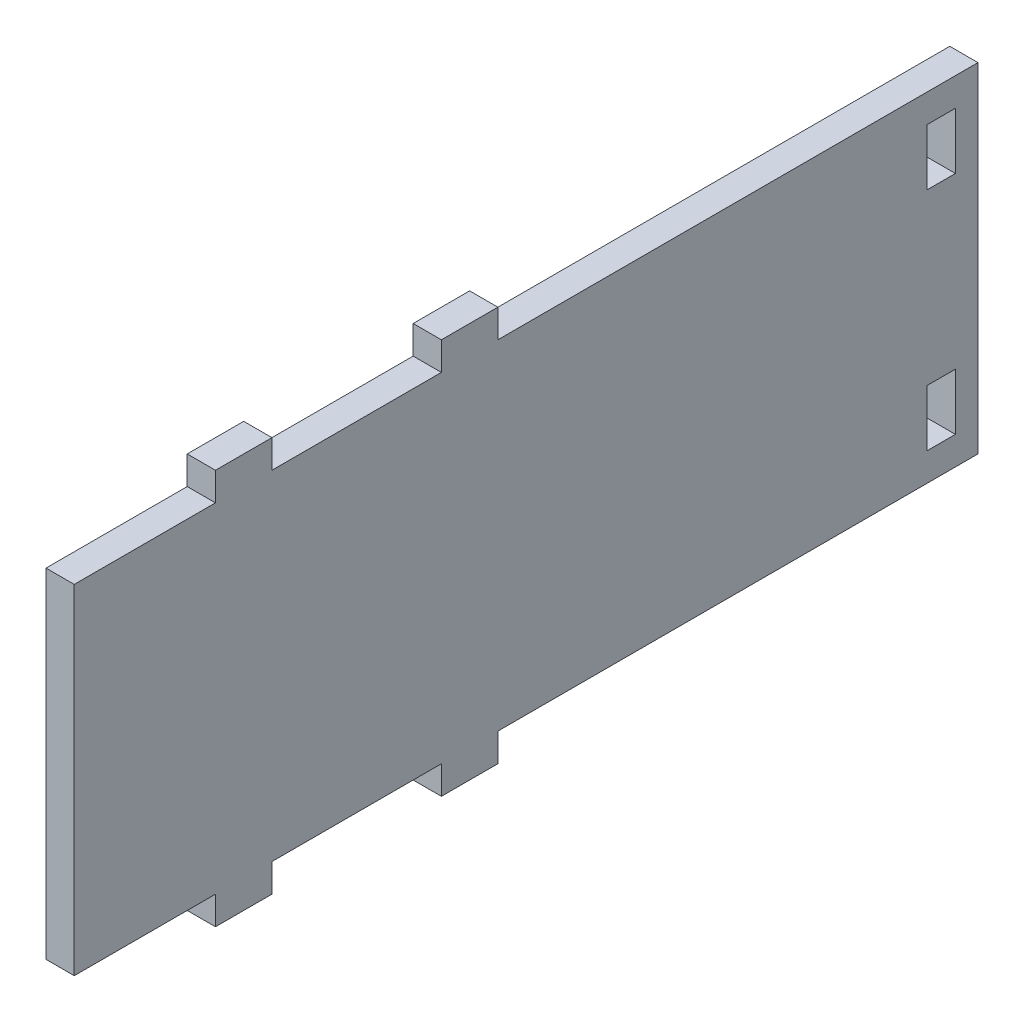
ISO-10303-21;
HEADER;
FILE_DESCRIPTION(('STEP AP214'),'2;1');
FILE_NAME('part.step','',(''),(''),'','','');
FILE_SCHEMA(('AUTOMOTIVE_DESIGN { 1 0 10303 214 1 1 1 1 }'));
ENDSEC;
DATA;
#1=APPLICATION_CONTEXT('core data for automotive mechanical design processes');
#2=APPLICATION_PROTOCOL_DEFINITION('international standard','automotive_design',2000,#1);
#3=PRODUCT_CONTEXT('',#1,'mechanical');
#4=PRODUCT('Part','Part','',(#3));
#5=PRODUCT_RELATED_PRODUCT_CATEGORY('part','',(#4));
#6=PRODUCT_DEFINITION_FORMATION('','',#4);
#7=PRODUCT_DEFINITION_CONTEXT('part definition',#1,'design');
#8=PRODUCT_DEFINITION('design','',#6,#7);
#9=PRODUCT_DEFINITION_SHAPE('','',#8);
#10=(LENGTH_UNIT() NAMED_UNIT(*) SI_UNIT(.MILLI.,.METRE.));
#11=(NAMED_UNIT(*) PLANE_ANGLE_UNIT() SI_UNIT($,.RADIAN.));
#12=(NAMED_UNIT(*) SI_UNIT($,.STERADIAN.) SOLID_ANGLE_UNIT());
#13=UNCERTAINTY_MEASURE_WITH_UNIT(LENGTH_MEASURE(1.E-05),#10,'distance_accuracy_value','');
#14=(GEOMETRIC_REPRESENTATION_CONTEXT(3) GLOBAL_UNCERTAINTY_ASSIGNED_CONTEXT((#13)) GLOBAL_UNIT_ASSIGNED_CONTEXT((#10,
#11,#12)) REPRESENTATION_CONTEXT('',''));
#15=CARTESIAN_POINT('',(0.,0.,0.));
#16=DIRECTION('',(0.,0.,1.));
#17=DIRECTION('',(1.,0.,0.));
#18=AXIS2_PLACEMENT_3D('',#15,#16,#17);
#19=CARTESIAN_POINT('',(2.5,-15.,0.));
#20=DIRECTION('',(0.,1.,0.));
#21=DIRECTION('',(0.,0.,1.));
#22=AXIS2_PLACEMENT_3D('',#19,#20,#21);
#23=PLANE('',#22);
#24=DIRECTION('',(0.,0.,-1.));
#25=VECTOR('',#24,1.);
#26=CARTESIAN_POINT('',(0.,-15.,0.));
#27=LINE('',#26,#25);
#28=CARTESIAN_POINT('',(0.,-15.,72.5));
#29=VERTEX_POINT('',#28);
#30=CARTESIAN_POINT('',(0.,-15.,57.5));
#31=VERTEX_POINT('',#30);
#32=EDGE_CURVE('E301',#29,#31,#27,.T.);
#33=ORIENTED_EDGE('',*,*,#32,.T.);
#34=DIRECTION('',(-1.,0.,0.));
#35=VECTOR('',#34,1.);
#36=CARTESIAN_POINT('',(2.5,-15.,57.5));
#37=LINE('',#36,#35);
#38=CARTESIAN_POINT('',(2.5,-15.,57.5));
#39=VERTEX_POINT('',#38);
#40=EDGE_CURVE('E11',#39,#31,#37,.T.);
#41=ORIENTED_EDGE('',*,*,#40,.F.);
#42=DIRECTION('',(0.,0.,-1.));
#43=VECTOR('',#42,1.);
#44=CARTESIAN_POINT('',(2.5,-15.,0.));
#45=LINE('',#44,#43);
#46=CARTESIAN_POINT('',(2.5,-15.,72.5));
#47=VERTEX_POINT('',#46);
#48=EDGE_CURVE('E519',#47,#39,#45,.T.);
#49=ORIENTED_EDGE('',*,*,#48,.F.);
#50=DIRECTION('',(-1.,0.,0.));
#51=VECTOR('',#50,1.);
#52=CARTESIAN_POINT('',(2.5,-15.,72.5));
#53=LINE('',#52,#51);
#54=EDGE_CURVE('E61',#47,#29,#53,.T.);
#55=ORIENTED_EDGE('',*,*,#54,.T.);
#56=EDGE_LOOP('',(#33,#41,#49,#55));
#57=FACE_BOUND('',#56,.T.);
#58=ADVANCED_FACE('F41',(#57),#23,.F.);
#59=CARTESIAN_POINT('',(2.5,0.,57.5));
#60=DIRECTION('',(0.,0.,-1.));
#61=DIRECTION('',(-1.,0.,0.));
#62=AXIS2_PLACEMENT_3D('',#59,#60,#61);
#63=PLANE('',#62);
#64=DIRECTION('',(0.,-1.,0.));
#65=VECTOR('',#64,1.);
#66=CARTESIAN_POINT('',(0.,0.,57.5));
#67=LINE('',#66,#65);
#68=CARTESIAN_POINT('',(0.,-17.5,57.5));
#69=VERTEX_POINT('',#68);
#70=EDGE_CURVE('E304',#31,#69,#67,.T.);
#71=ORIENTED_EDGE('',*,*,#70,.T.);
#72=DIRECTION('',(-1.,0.,0.));
#73=VECTOR('',#72,1.);
#74=CARTESIAN_POINT('',(2.5,-17.5,57.5));
#75=LINE('',#74,#73);
#76=CARTESIAN_POINT('',(2.5,-17.5,57.5));
#77=VERTEX_POINT('',#76);
#78=EDGE_CURVE('E52',#77,#69,#75,.T.);
#79=ORIENTED_EDGE('',*,*,#78,.F.);
#80=DIRECTION('',(0.,-1.,0.));
#81=VECTOR('',#80,1.);
#82=CARTESIAN_POINT('',(2.5,0.,57.5));
#83=LINE('',#82,#81);
#84=EDGE_CURVE('E594',#39,#77,#83,.T.);
#85=ORIENTED_EDGE('',*,*,#84,.F.);
#86=ORIENTED_EDGE('',*,*,#40,.T.);
#87=EDGE_LOOP('',(#71,#79,#85,#86));
#88=FACE_BOUND('',#87,.T.);
#89=ADVANCED_FACE('F471',(#88),#63,.F.);
#90=CARTESIAN_POINT('',(2.5,-17.5,0.));
#91=DIRECTION('',(0.,1.,0.));
#92=DIRECTION('',(0.,0.,1.));
#93=AXIS2_PLACEMENT_3D('',#90,#91,#92);
#94=PLANE('',#93);
#95=DIRECTION('',(0.,0.,-1.));
#96=VECTOR('',#95,1.);
#97=CARTESIAN_POINT('',(0.,-17.5,0.));
#98=LINE('',#97,#96);
#99=CARTESIAN_POINT('',(0.,-17.5,52.5));
#100=VERTEX_POINT('',#99);
#101=EDGE_CURVE('E308',#69,#100,#98,.T.);
#102=ORIENTED_EDGE('',*,*,#101,.T.);
#103=DIRECTION('',(-1.,0.,0.));
#104=VECTOR('',#103,1.);
#105=CARTESIAN_POINT('',(2.5,-17.5,52.5));
#106=LINE('',#105,#104);
#107=CARTESIAN_POINT('',(2.5,-17.5,52.5));
#108=VERTEX_POINT('',#107);
#109=EDGE_CURVE('E416',#108,#100,#106,.T.);
#110=ORIENTED_EDGE('',*,*,#109,.F.);
#111=DIRECTION('',(0.,0.,-1.));
#112=VECTOR('',#111,1.);
#113=CARTESIAN_POINT('',(2.5,-17.5,0.));
#114=LINE('',#113,#112);
#115=EDGE_CURVE('E596',#77,#108,#114,.T.);
#116=ORIENTED_EDGE('',*,*,#115,.F.);
#117=ORIENTED_EDGE('',*,*,#78,.T.);
#118=EDGE_LOOP('',(#102,#110,#116,#117));
#119=FACE_BOUND('',#118,.T.);
#120=ADVANCED_FACE('F477',(#119),#94,.F.);
#121=CARTESIAN_POINT('',(2.5,0.,52.5));
#122=DIRECTION('',(0.,0.,-1.));
#123=DIRECTION('',(-1.,0.,0.));
#124=AXIS2_PLACEMENT_3D('',#121,#122,#123);
#125=PLANE('',#124);
#126=DIRECTION('',(0.,-1.,0.));
#127=VECTOR('',#126,1.);
#128=CARTESIAN_POINT('',(0.,0.,52.5));
#129=LINE('',#128,#127);
#130=CARTESIAN_POINT('',(0.,-15.,52.5));
#131=VERTEX_POINT('',#130);
#132=EDGE_CURVE('E312',#131,#100,#129,.T.);
#133=ORIENTED_EDGE('',*,*,#132,.F.);
#134=DIRECTION('',(-1.,0.,0.));
#135=VECTOR('',#134,1.);
#136=CARTESIAN_POINT('',(2.5,-15.,52.5));
#137=LINE('',#136,#135);
#138=CARTESIAN_POINT('',(2.5,-15.,52.5));
#139=VERTEX_POINT('',#138);
#140=EDGE_CURVE('E413',#139,#131,#137,.T.);
#141=ORIENTED_EDGE('',*,*,#140,.F.);
#142=DIRECTION('',(0.,-1.,0.));
#143=VECTOR('',#142,1.);
#144=CARTESIAN_POINT('',(2.5,0.,52.5));
#145=LINE('',#144,#143);
#146=EDGE_CURVE('E517',#139,#108,#145,.T.);
#147=ORIENTED_EDGE('',*,*,#146,.T.);
#148=ORIENTED_EDGE('',*,*,#109,.T.);
#149=EDGE_LOOP('',(#133,#141,#147,#148));
#150=FACE_BOUND('',#149,.T.);
#151=ADVANCED_FACE('F484',(#150),#125,.T.);
#152=CARTESIAN_POINT('',(0.,-15.,9.99999999999998));
#153=VERTEX_POINT('',#152);
#154=EDGE_CURVE('E305',#131,#153,#27,.T.);
#155=ORIENTED_EDGE('',*,*,#154,.T.);
#156=DIRECTION('',(-1.,0.,0.));
#157=VECTOR('',#156,1.);
#158=CARTESIAN_POINT('',(2.5,-15.,9.99999999999998));
#159=LINE('',#158,#157);
#160=CARTESIAN_POINT('',(2.5,-15.,9.99999999999998));
#161=VERTEX_POINT('',#160);
#162=EDGE_CURVE('E410',#161,#153,#159,.T.);
#163=ORIENTED_EDGE('',*,*,#162,.F.);
#164=EDGE_CURVE('E510',#139,#161,#45,.T.);
#165=ORIENTED_EDGE('',*,*,#164,.F.);
#166=ORIENTED_EDGE('',*,*,#140,.T.);
#167=EDGE_LOOP('',(#155,#163,#165,#166));
#168=FACE_BOUND('',#167,.T.);
#169=ADVANCED_FACE('F473',(#168),#23,.F.);
#170=CARTESIAN_POINT('',(2.5,0.,9.99999999999998));
#171=DIRECTION('',(0.,0.,-1.));
#172=DIRECTION('',(-1.,0.,0.));
#173=AXIS2_PLACEMENT_3D('',#170,#171,#172);
#174=PLANE('',#173);
#175=DIRECTION('',(0.,-1.,0.));
#176=VECTOR('',#175,1.);
#177=CARTESIAN_POINT('',(0.,0.,9.99999999999998));
#178=LINE('',#177,#176);
#179=CARTESIAN_POINT('',(0.,15.,9.99999999999998));
#180=VERTEX_POINT('',#179);
#181=EDGE_CURVE('E316',#180,#153,#178,.T.);
#182=ORIENTED_EDGE('',*,*,#181,.F.);
#183=DIRECTION('',(-1.,0.,0.));
#184=VECTOR('',#183,1.);
#185=CARTESIAN_POINT('',(2.5,15.,9.99999999999998));
#186=LINE('',#185,#184);
#187=CARTESIAN_POINT('',(2.5,15.,9.99999999999998));
#188=VERTEX_POINT('',#187);
#189=EDGE_CURVE('E407',#188,#180,#186,.T.);
#190=ORIENTED_EDGE('',*,*,#189,.F.);
#191=DIRECTION('',(0.,-1.,0.));
#192=VECTOR('',#191,1.);
#193=CARTESIAN_POINT('',(2.5,0.,9.99999999999998));
#194=LINE('',#193,#192);
#195=EDGE_CURVE('E505',#188,#161,#194,.T.);
#196=ORIENTED_EDGE('',*,*,#195,.T.);
#197=ORIENTED_EDGE('',*,*,#162,.T.);
#198=EDGE_LOOP('',(#182,#190,#196,#197));
#199=FACE_BOUND('',#198,.T.);
#200=ADVANCED_FACE('F483',(#199),#174,.T.);
#201=CARTESIAN_POINT('',(2.5,15.,0.));
#202=DIRECTION('',(0.,1.,0.));
#203=DIRECTION('',(0.,0.,1.));
#204=AXIS2_PLACEMENT_3D('',#201,#202,#203);
#205=PLANE('',#204);
#206=DIRECTION('',(0.,0.,-1.));
#207=VECTOR('',#206,1.);
#208=CARTESIAN_POINT('',(0.,15.,0.));
#209=LINE('',#208,#207);
#210=CARTESIAN_POINT('',(0.,15.,52.5));
#211=VERTEX_POINT('',#210);
#212=EDGE_CURVE('E320',#211,#180,#209,.T.);
#213=ORIENTED_EDGE('',*,*,#212,.F.);
#214=DIRECTION('',(-1.,0.,0.));
#215=VECTOR('',#214,1.);
#216=CARTESIAN_POINT('',(2.5,15.,52.5));
#217=LINE('',#216,#215);
#218=CARTESIAN_POINT('',(2.5,15.,52.5));
#219=VERTEX_POINT('',#218);
#220=EDGE_CURVE('E404',#219,#211,#217,.T.);
#221=ORIENTED_EDGE('',*,*,#220,.F.);
#222=DIRECTION('',(0.,0.,-1.));
#223=VECTOR('',#222,1.);
#224=CARTESIAN_POINT('',(2.5,15.,0.));
#225=LINE('',#224,#223);
#226=EDGE_CURVE('E509',#219,#188,#225,.T.);
#227=ORIENTED_EDGE('',*,*,#226,.T.);
#228=ORIENTED_EDGE('',*,*,#189,.T.);
#229=EDGE_LOOP('',(#213,#221,#227,#228));
#230=FACE_BOUND('',#229,.T.);
#231=ADVANCED_FACE('F490',(#230),#205,.T.);
#232=CARTESIAN_POINT('',(2.5,0.,52.5));
#233=DIRECTION('',(0.,0.,1.));
#234=DIRECTION('',(1.,0.,0.));
#235=AXIS2_PLACEMENT_3D('',#232,#233,#234);
#236=PLANE('',#235);
#237=DIRECTION('',(0.,1.,0.));
#238=VECTOR('',#237,1.);
#239=CARTESIAN_POINT('',(0.,0.,52.5));
#240=LINE('',#239,#238);
#241=CARTESIAN_POINT('',(0.,17.5,52.5));
#242=VERTEX_POINT('',#241);
#243=EDGE_CURVE('E324',#211,#242,#240,.T.);
#244=ORIENTED_EDGE('',*,*,#243,.T.);
#245=DIRECTION('',(-1.,0.,0.));
#246=VECTOR('',#245,1.);
#247=CARTESIAN_POINT('',(2.5,17.5,52.5));
#248=LINE('',#247,#246);
#249=CARTESIAN_POINT('',(2.5,17.5,52.5));
#250=VERTEX_POINT('',#249);
#251=EDGE_CURVE('E401',#250,#242,#248,.T.);
#252=ORIENTED_EDGE('',*,*,#251,.F.);
#253=DIRECTION('',(0.,1.,0.));
#254=VECTOR('',#253,1.);
#255=CARTESIAN_POINT('',(2.5,0.,52.5));
#256=LINE('',#255,#254);
#257=EDGE_CURVE('E514',#219,#250,#256,.T.);
#258=ORIENTED_EDGE('',*,*,#257,.F.);
#259=ORIENTED_EDGE('',*,*,#220,.T.);
#260=EDGE_LOOP('',(#244,#252,#258,#259));
#261=FACE_BOUND('',#260,.T.);
#262=ADVANCED_FACE('F654',(#261),#236,.F.);
#263=CARTESIAN_POINT('',(2.5,17.5,0.));
#264=DIRECTION('',(0.,1.,0.));
#265=DIRECTION('',(0.,0.,1.));
#266=AXIS2_PLACEMENT_3D('',#263,#264,#265);
#267=PLANE('',#266);
#268=DIRECTION('',(0.,0.,-1.));
#269=VECTOR('',#268,1.);
#270=CARTESIAN_POINT('',(0.,17.5,0.));
#271=LINE('',#270,#269);
#272=CARTESIAN_POINT('',(0.,17.5,57.5));
#273=VERTEX_POINT('',#272);
#274=EDGE_CURVE('E329',#273,#242,#271,.T.);
#275=ORIENTED_EDGE('',*,*,#274,.F.);
#276=DIRECTION('',(-1.,0.,0.));
#277=VECTOR('',#276,1.);
#278=CARTESIAN_POINT('',(2.5,17.5,57.5));
#279=LINE('',#278,#277);
#280=CARTESIAN_POINT('',(2.5,17.5,57.5));
#281=VERTEX_POINT('',#280);
#282=EDGE_CURVE('E398',#281,#273,#279,.T.);
#283=ORIENTED_EDGE('',*,*,#282,.F.);
#284=DIRECTION('',(0.,0.,-1.));
#285=VECTOR('',#284,1.);
#286=CARTESIAN_POINT('',(2.5,17.5,0.));
#287=LINE('',#286,#285);
#288=EDGE_CURVE('E525',#281,#250,#287,.T.);
#289=ORIENTED_EDGE('',*,*,#288,.T.);
#290=ORIENTED_EDGE('',*,*,#251,.T.);
#291=EDGE_LOOP('',(#275,#283,#289,#290));
#292=FACE_BOUND('',#291,.T.);
#293=ADVANCED_FACE('F651',(#292),#267,.T.);
#294=CARTESIAN_POINT('',(2.5,0.,57.5));
#295=DIRECTION('',(0.,0.,1.));
#296=DIRECTION('',(1.,0.,0.));
#297=AXIS2_PLACEMENT_3D('',#294,#295,#296);
#298=PLANE('',#297);
#299=DIRECTION('',(0.,1.,0.));
#300=VECTOR('',#299,1.);
#301=CARTESIAN_POINT('',(0.,0.,57.5));
#302=LINE('',#301,#300);
#303=CARTESIAN_POINT('',(0.,15.,57.5));
#304=VERTEX_POINT('',#303);
#305=EDGE_CURVE('E333',#304,#273,#302,.T.);
#306=ORIENTED_EDGE('',*,*,#305,.F.);
#307=DIRECTION('',(-1.,0.,0.));
#308=VECTOR('',#307,1.);
#309=CARTESIAN_POINT('',(2.5,15.,57.5));
#310=LINE('',#309,#308);
#311=CARTESIAN_POINT('',(2.5,15.,57.5));
#312=VERTEX_POINT('',#311);
#313=EDGE_CURVE('E395',#312,#304,#310,.T.);
#314=ORIENTED_EDGE('',*,*,#313,.F.);
#315=DIRECTION('',(0.,1.,0.));
#316=VECTOR('',#315,1.);
#317=CARTESIAN_POINT('',(2.5,0.,57.5));
#318=LINE('',#317,#316);
#319=EDGE_CURVE('E529',#312,#281,#318,.T.);
#320=ORIENTED_EDGE('',*,*,#319,.T.);
#321=ORIENTED_EDGE('',*,*,#282,.T.);
#322=EDGE_LOOP('',(#306,#314,#320,#321));
#323=FACE_BOUND('',#322,.T.);
#324=ADVANCED_FACE('F563',(#323),#298,.T.);
#325=CARTESIAN_POINT('',(0.,15.,72.5));
#326=VERTEX_POINT('',#325);
#327=EDGE_CURVE('E325',#326,#304,#209,.T.);
#328=ORIENTED_EDGE('',*,*,#327,.F.);
#329=DIRECTION('',(-1.,0.,0.));
#330=VECTOR('',#329,1.);
#331=CARTESIAN_POINT('',(2.5,15.,72.5));
#332=LINE('',#331,#330);
#333=CARTESIAN_POINT('',(2.5,15.,72.5));
#334=VERTEX_POINT('',#333);
#335=EDGE_CURVE('E392',#334,#326,#332,.T.);
#336=ORIENTED_EDGE('',*,*,#335,.F.);
#337=EDGE_CURVE('E516',#334,#312,#225,.T.);
#338=ORIENTED_EDGE('',*,*,#337,.T.);
#339=ORIENTED_EDGE('',*,*,#313,.T.);
#340=EDGE_LOOP('',(#328,#336,#338,#339));
#341=FACE_BOUND('',#340,.T.);
#342=ADVANCED_FACE('F555',(#341),#205,.T.);
#343=CARTESIAN_POINT('',(2.5,0.,72.5));
#344=DIRECTION('',(0.,0.,1.));
#345=DIRECTION('',(1.,0.,0.));
#346=AXIS2_PLACEMENT_3D('',#343,#344,#345);
#347=PLANE('',#346);
#348=DIRECTION('',(0.,1.,0.));
#349=VECTOR('',#348,1.);
#350=CARTESIAN_POINT('',(0.,0.,72.5));
#351=LINE('',#350,#349);
#352=CARTESIAN_POINT('',(0.,17.4999999999999,72.5));
#353=VERTEX_POINT('',#352);
#354=EDGE_CURVE('E337',#326,#353,#351,.T.);
#355=ORIENTED_EDGE('',*,*,#354,.T.);
#356=DIRECTION('',(-1.,0.,0.));
#357=VECTOR('',#356,1.);
#358=CARTESIAN_POINT('',(2.5,17.4999999999999,72.5));
#359=LINE('',#358,#357);
#360=CARTESIAN_POINT('',(2.5,17.4999999999999,72.5));
#361=VERTEX_POINT('',#360);
#362=EDGE_CURVE('E389',#361,#353,#359,.T.);
#363=ORIENTED_EDGE('',*,*,#362,.F.);
#364=DIRECTION('',(0.,1.,0.));
#365=VECTOR('',#364,1.);
#366=CARTESIAN_POINT('',(2.5,0.,72.5));
#367=LINE('',#366,#365);
#368=EDGE_CURVE('E533',#334,#361,#367,.T.);
#369=ORIENTED_EDGE('',*,*,#368,.F.);
#370=ORIENTED_EDGE('',*,*,#335,.T.);
#371=EDGE_LOOP('',(#355,#363,#369,#370));
#372=FACE_BOUND('',#371,.T.);
#373=ADVANCED_FACE('F642',(#372),#347,.F.);
#374=CARTESIAN_POINT('',(2.5,17.4999999999999,0.));
#375=DIRECTION('',(0.,1.,0.));
#376=DIRECTION('',(0.,0.,1.));
#377=AXIS2_PLACEMENT_3D('',#374,#375,#376);
#378=PLANE('',#377);
#379=DIRECTION('',(0.,0.,-1.));
#380=VECTOR('',#379,1.);
#381=CARTESIAN_POINT('',(0.,17.4999999999999,0.));
#382=LINE('',#381,#380);
#383=CARTESIAN_POINT('',(0.,17.4999999999999,77.5));
#384=VERTEX_POINT('',#383);
#385=EDGE_CURVE('E341',#384,#353,#382,.T.);
#386=ORIENTED_EDGE('',*,*,#385,.F.);
#387=DIRECTION('',(-1.,0.,0.));
#388=VECTOR('',#387,1.);
#389=CARTESIAN_POINT('',(2.5,17.4999999999999,77.5));
#390=LINE('',#389,#388);
#391=CARTESIAN_POINT('',(2.5,17.4999999999999,77.5));
#392=VERTEX_POINT('',#391);
#393=EDGE_CURVE('E386',#392,#384,#390,.T.);
#394=ORIENTED_EDGE('',*,*,#393,.F.);
#395=DIRECTION('',(0.,0.,-1.));
#396=VECTOR('',#395,1.);
#397=CARTESIAN_POINT('',(2.5,17.4999999999999,0.));
#398=LINE('',#397,#396);
#399=EDGE_CURVE('E536',#392,#361,#398,.T.);
#400=ORIENTED_EDGE('',*,*,#399,.T.);
#401=ORIENTED_EDGE('',*,*,#362,.T.);
#402=EDGE_LOOP('',(#386,#394,#400,#401));
#403=FACE_BOUND('',#402,.T.);
#404=ADVANCED_FACE('F638',(#403),#378,.T.);
#405=CARTESIAN_POINT('',(2.5,0.,77.5));
#406=DIRECTION('',(0.,0.,1.));
#407=DIRECTION('',(1.,0.,0.));
#408=AXIS2_PLACEMENT_3D('',#405,#406,#407);
#409=PLANE('',#408);
#410=DIRECTION('',(0.,1.,0.));
#411=VECTOR('',#410,1.);
#412=CARTESIAN_POINT('',(0.,0.,77.5));
#413=LINE('',#412,#411);
#414=CARTESIAN_POINT('',(0.,15.,77.5));
#415=VERTEX_POINT('',#414);
#416=EDGE_CURVE('E345',#415,#384,#413,.T.);
#417=ORIENTED_EDGE('',*,*,#416,.F.);
#418=DIRECTION('',(-1.,0.,0.));
#419=VECTOR('',#418,1.);
#420=CARTESIAN_POINT('',(2.5,15.,77.5));
#421=LINE('',#420,#419);
#422=CARTESIAN_POINT('',(2.5,15.,77.5));
#423=VERTEX_POINT('',#422);
#424=EDGE_CURVE('E383',#423,#415,#421,.T.);
#425=ORIENTED_EDGE('',*,*,#424,.F.);
#426=DIRECTION('',(0.,1.,0.));
#427=VECTOR('',#426,1.);
#428=CARTESIAN_POINT('',(2.5,0.,77.5));
#429=LINE('',#428,#427);
#430=EDGE_CURVE('E540',#423,#392,#429,.T.);
#431=ORIENTED_EDGE('',*,*,#430,.T.);
#432=ORIENTED_EDGE('',*,*,#393,.T.);
#433=EDGE_LOOP('',(#417,#425,#431,#432));
#434=FACE_BOUND('',#433,.T.);
#435=ADVANCED_FACE('F634',(#434),#409,.T.);
#436=CARTESIAN_POINT('',(2.5,15.,0.));
#437=DIRECTION('',(0.,-1.,0.));
#438=DIRECTION('',(0.,0.,-1.));
#439=AXIS2_PLACEMENT_3D('',#436,#437,#438);
#440=PLANE('',#439);
#441=DIRECTION('',(0.,0.,1.));
#442=VECTOR('',#441,1.);
#443=CARTESIAN_POINT('',(0.,15.,0.));
#444=LINE('',#443,#442);
#445=CARTESIAN_POINT('',(0.,15.,90.));
#446=VERTEX_POINT('',#445);
#447=EDGE_CURVE('E349',#415,#446,#444,.T.);
#448=ORIENTED_EDGE('',*,*,#447,.T.);
#449=DIRECTION('',(-1.,0.,0.));
#450=VECTOR('',#449,1.);
#451=CARTESIAN_POINT('',(2.5,15.,90.));
#452=LINE('',#451,#450);
#453=CARTESIAN_POINT('',(2.5,15.,90.));
#454=VERTEX_POINT('',#453);
#455=EDGE_CURVE('E379',#454,#446,#452,.T.);
#456=ORIENTED_EDGE('',*,*,#455,.F.);
#457=DIRECTION('',(0.,0.,1.));
#458=VECTOR('',#457,1.);
#459=CARTESIAN_POINT('',(2.5,15.,0.));
#460=LINE('',#459,#458);
#461=EDGE_CURVE('E544',#423,#454,#460,.T.);
#462=ORIENTED_EDGE('',*,*,#461,.F.);
#463=ORIENTED_EDGE('',*,*,#424,.T.);
#464=EDGE_LOOP('',(#448,#456,#462,#463));
#465=FACE_BOUND('',#464,.T.);
#466=ADVANCED_FACE('F630',(#465),#440,.F.);
#467=CARTESIAN_POINT('',(2.5,0.,90.));
#468=DIRECTION('',(0.,0.,-1.));
#469=DIRECTION('',(-1.,0.,0.));
#470=AXIS2_PLACEMENT_3D('',#467,#468,#469);
#471=PLANE('',#470);
#472=DIRECTION('',(0.,-1.,0.));
#473=VECTOR('',#472,1.);
#474=CARTESIAN_POINT('',(0.,0.,90.));
#475=LINE('',#474,#473);
#476=CARTESIAN_POINT('',(0.,-15.,90.));
#477=VERTEX_POINT('',#476);
#478=EDGE_CURVE('E352',#446,#477,#475,.T.);
#479=ORIENTED_EDGE('',*,*,#478,.T.);
#480=DIRECTION('',(-1.,0.,0.));
#481=VECTOR('',#480,1.);
#482=CARTESIAN_POINT('',(2.5,-15.,90.));
#483=LINE('',#482,#481);
#484=CARTESIAN_POINT('',(2.5,-15.,90.));
#485=VERTEX_POINT('',#484);
#486=EDGE_CURVE('E375',#485,#477,#483,.T.);
#487=ORIENTED_EDGE('',*,*,#486,.F.);
#488=DIRECTION('',(0.,-1.,0.));
#489=VECTOR('',#488,1.);
#490=CARTESIAN_POINT('',(2.5,0.,90.));
#491=LINE('',#490,#489);
#492=EDGE_CURVE('E547',#454,#485,#491,.T.);
#493=ORIENTED_EDGE('',*,*,#492,.F.);
#494=ORIENTED_EDGE('',*,*,#455,.T.);
#495=EDGE_LOOP('',(#479,#487,#493,#494));
#496=FACE_BOUND('',#495,.T.);
#497=ADVANCED_FACE('F626',(#496),#471,.F.);
#498=CARTESIAN_POINT('',(2.5,-15.,0.));
#499=DIRECTION('',(0.,1.,0.));
#500=DIRECTION('',(0.,0.,1.));
#501=AXIS2_PLACEMENT_3D('',#498,#499,#500);
#502=PLANE('',#501);
#503=DIRECTION('',(0.,0.,-1.));
#504=VECTOR('',#503,1.);
#505=CARTESIAN_POINT('',(0.,-15.,0.));
#506=LINE('',#505,#504);
#507=CARTESIAN_POINT('',(0.,-15.,77.5));
#508=VERTEX_POINT('',#507);
#509=EDGE_CURVE('E355',#477,#508,#506,.T.);
#510=ORIENTED_EDGE('',*,*,#509,.T.);
#511=DIRECTION('',(-1.,0.,0.));
#512=VECTOR('',#511,1.);
#513=CARTESIAN_POINT('',(2.5,-15.,77.5));
#514=LINE('',#513,#512);
#515=CARTESIAN_POINT('',(2.5,-15.,77.5));
#516=VERTEX_POINT('',#515);
#517=EDGE_CURVE('E258',#516,#508,#514,.T.);
#518=ORIENTED_EDGE('',*,*,#517,.F.);
#519=DIRECTION('',(0.,0.,-1.));
#520=VECTOR('',#519,1.);
#521=CARTESIAN_POINT('',(2.5,-15.,0.));
#522=LINE('',#521,#520);
#523=EDGE_CURVE('E244',#485,#516,#522,.T.);
#524=ORIENTED_EDGE('',*,*,#523,.F.);
#525=ORIENTED_EDGE('',*,*,#486,.T.);
#526=EDGE_LOOP('',(#510,#518,#524,#525));
#527=FACE_BOUND('',#526,.T.);
#528=ADVANCED_FACE('F623',(#527),#502,.F.);
#529=CARTESIAN_POINT('',(2.5,0.,77.5));
#530=DIRECTION('',(0.,0.,-1.));
#531=DIRECTION('',(-1.,0.,0.));
#532=AXIS2_PLACEMENT_3D('',#529,#530,#531);
#533=PLANE('',#532);
#534=DIRECTION('',(0.,-1.,0.));
#535=VECTOR('',#534,1.);
#536=CARTESIAN_POINT('',(0.,0.,77.5));
#537=LINE('',#536,#535);
#538=CARTESIAN_POINT('',(0.,-17.5000000000001,77.5));
#539=VERTEX_POINT('',#538);
#540=EDGE_CURVE('E254',#508,#539,#537,.T.);
#541=ORIENTED_EDGE('',*,*,#540,.T.);
#542=DIRECTION('',(-1.,0.,0.));
#543=VECTOR('',#542,1.);
#544=CARTESIAN_POINT('',(2.5,-17.5000000000001,77.5));
#545=LINE('',#544,#543);
#546=CARTESIAN_POINT('',(2.5,-17.5000000000001,77.5));
#547=VERTEX_POINT('',#546);
#548=EDGE_CURVE('E251',#547,#539,#545,.T.);
#549=ORIENTED_EDGE('',*,*,#548,.F.);
#550=DIRECTION('',(0.,-1.,0.));
#551=VECTOR('',#550,1.);
#552=CARTESIAN_POINT('',(2.5,0.,77.5));
#553=LINE('',#552,#551);
#554=EDGE_CURVE('E236',#516,#547,#553,.T.);
#555=ORIENTED_EDGE('',*,*,#554,.F.);
#556=ORIENTED_EDGE('',*,*,#517,.T.);
#557=EDGE_LOOP('',(#541,#549,#555,#556));
#558=FACE_BOUND('',#557,.T.);
#559=ADVANCED_FACE('F252',(#558),#533,.F.);
#560=CARTESIAN_POINT('',(2.5,-17.5000000000001,0.));
#561=DIRECTION('',(0.,1.,0.));
#562=DIRECTION('',(0.,0.,1.));
#563=AXIS2_PLACEMENT_3D('',#560,#561,#562);
#564=PLANE('',#563);
#565=DIRECTION('',(0.,0.,-1.));
#566=VECTOR('',#565,1.);
#567=CARTESIAN_POINT('',(0.,-17.5000000000001,0.));
#568=LINE('',#567,#566);
#569=CARTESIAN_POINT('',(0.,-17.5000000000001,72.5));
#570=VERTEX_POINT('',#569);
#571=EDGE_CURVE('E360',#539,#570,#568,.T.);
#572=ORIENTED_EDGE('',*,*,#571,.T.);
#573=DIRECTION('',(-1.,0.,0.));
#574=VECTOR('',#573,1.);
#575=CARTESIAN_POINT('',(2.5,-17.5000000000001,72.5));
#576=LINE('',#575,#574);
#577=CARTESIAN_POINT('',(2.5,-17.5000000000001,72.5));
#578=VERTEX_POINT('',#577);
#579=EDGE_CURVE('E148',#578,#570,#576,.T.);
#580=ORIENTED_EDGE('',*,*,#579,.F.);
#581=DIRECTION('',(0.,0.,-1.));
#582=VECTOR('',#581,1.);
#583=CARTESIAN_POINT('',(2.5,-17.5000000000001,0.));
#584=LINE('',#583,#582);
#585=EDGE_CURVE('E242',#547,#578,#584,.T.);
#586=ORIENTED_EDGE('',*,*,#585,.F.);
#587=ORIENTED_EDGE('',*,*,#548,.T.);
#588=EDGE_LOOP('',(#572,#580,#586,#587));
#589=FACE_BOUND('',#588,.T.);
#590=ADVANCED_FACE('F260',(#589),#564,.F.);
#591=CARTESIAN_POINT('',(2.5,0.,14.5));
#592=DIRECTION('',(0.,0.,-1.));
#593=DIRECTION('',(0.,1.,0.));
#594=AXIS2_PLACEMENT_3D('',#591,#592,#593);
#595=PLANE('',#594);
#596=DIRECTION('',(0.,-1.,0.));
#597=VECTOR('',#596,1.);
#598=CARTESIAN_POINT('',(0.,0.,14.5));
#599=LINE('',#598,#597);
#600=CARTESIAN_POINT('',(0.,12.5,14.5));
#601=VERTEX_POINT('',#600);
#602=CARTESIAN_POINT('',(0.,7.50000000000001,14.5));
#603=VERTEX_POINT('',#602);
#604=EDGE_CURVE('E285',#601,#603,#599,.T.);
#605=ORIENTED_EDGE('',*,*,#604,.F.);
#606=DIRECTION('',(-1.,0.,0.));
#607=VECTOR('',#606,1.);
#608=CARTESIAN_POINT('',(2.5,12.5,14.5));
#609=LINE('',#608,#607);
#610=CARTESIAN_POINT('',(2.5,12.5,14.5));
#611=VERTEX_POINT('',#610);
#612=EDGE_CURVE('E370',#611,#601,#609,.T.);
#613=ORIENTED_EDGE('',*,*,#612,.F.);
#614=DIRECTION('',(0.,-1.,0.));
#615=VECTOR('',#614,1.);
#616=CARTESIAN_POINT('',(2.5,0.,14.5));
#617=LINE('',#616,#615);
#618=CARTESIAN_POINT('',(2.5,7.50000000000001,14.5));
#619=VERTEX_POINT('',#618);
#620=EDGE_CURVE('E577',#611,#619,#617,.T.);
#621=ORIENTED_EDGE('',*,*,#620,.T.);
#622=DIRECTION('',(-1.,0.,0.));
#623=VECTOR('',#622,1.);
#624=CARTESIAN_POINT('',(2.5,7.50000000000001,14.5));
#625=LINE('',#624,#623);
#626=EDGE_CURVE('E422',#619,#603,#625,.T.);
#627=ORIENTED_EDGE('',*,*,#626,.T.);
#628=EDGE_LOOP('',(#605,#613,#621,#627));
#629=FACE_BOUND('',#628,.T.);
#630=ADVANCED_FACE('F620',(#629),#595,.T.);
#631=CARTESIAN_POINT('',(2.5,12.5,0.));
#632=DIRECTION('',(0.,-1.,0.));
#633=DIRECTION('',(0.,0.,-1.));
#634=AXIS2_PLACEMENT_3D('',#631,#632,#633);
#635=PLANE('',#634);
#636=DIRECTION('',(0.,0.,1.));
#637=VECTOR('',#636,1.);
#638=CARTESIAN_POINT('',(0.,12.5,0.));
#639=LINE('',#638,#637);
#640=CARTESIAN_POINT('',(0.,12.5,12.));
#641=VERTEX_POINT('',#640);
#642=EDGE_CURVE('E289',#641,#601,#639,.T.);
#643=ORIENTED_EDGE('',*,*,#642,.F.);
#644=DIRECTION('',(-1.,0.,0.));
#645=VECTOR('',#644,1.);
#646=CARTESIAN_POINT('',(2.5,12.5,12.));
#647=LINE('',#646,#645);
#648=CARTESIAN_POINT('',(2.5,12.5,12.));
#649=VERTEX_POINT('',#648);
#650=EDGE_CURVE('E429',#649,#641,#647,.T.);
#651=ORIENTED_EDGE('',*,*,#650,.F.);
#652=DIRECTION('',(0.,0.,1.));
#653=VECTOR('',#652,1.);
#654=CARTESIAN_POINT('',(2.5,12.5,0.));
#655=LINE('',#654,#653);
#656=EDGE_CURVE('E581',#649,#611,#655,.T.);
#657=ORIENTED_EDGE('',*,*,#656,.T.);
#658=ORIENTED_EDGE('',*,*,#612,.T.);
#659=EDGE_LOOP('',(#643,#651,#657,#658));
#660=FACE_BOUND('',#659,.T.);
#661=ADVANCED_FACE('F748',(#660),#635,.T.);
#662=CARTESIAN_POINT('',(2.5,0.,12.));
#663=DIRECTION('',(0.,0.,-1.));
#664=DIRECTION('',(-1.,0.,0.));
#665=AXIS2_PLACEMENT_3D('',#662,#663,#664);
#666=PLANE('',#665);
#667=DIRECTION('',(0.,-1.,0.));
#668=VECTOR('',#667,1.);
#669=CARTESIAN_POINT('',(0.,0.,12.));
#670=LINE('',#669,#668);
#671=CARTESIAN_POINT('',(0.,7.50000000000001,12.));
#672=VERTEX_POINT('',#671);
#673=EDGE_CURVE('E293',#641,#672,#670,.T.);
#674=ORIENTED_EDGE('',*,*,#673,.T.);
#675=DIRECTION('',(-1.,0.,0.));
#676=VECTOR('',#675,1.);
#677=CARTESIAN_POINT('',(2.5,7.50000000000001,12.));
#678=LINE('',#677,#676);
#679=CARTESIAN_POINT('',(2.5,7.50000000000001,12.));
#680=VERTEX_POINT('',#679);
#681=EDGE_CURVE('E425',#680,#672,#678,.T.);
#682=ORIENTED_EDGE('',*,*,#681,.F.);
#683=DIRECTION('',(0.,-1.,0.));
#684=VECTOR('',#683,1.);
#685=CARTESIAN_POINT('',(2.5,0.,12.));
#686=LINE('',#685,#684);
#687=EDGE_CURVE('E585',#649,#680,#686,.T.);
#688=ORIENTED_EDGE('',*,*,#687,.F.);
#689=ORIENTED_EDGE('',*,*,#650,.T.);
#690=EDGE_LOOP('',(#674,#682,#688,#689));
#691=FACE_BOUND('',#690,.T.);
#692=ADVANCED_FACE('F745',(#691),#666,.F.);
#693=CARTESIAN_POINT('',(2.5,0.,11.9999999999998));
#694=DIRECTION('',(0.,0.,-1.));
#695=DIRECTION('',(-1.,0.,0.));
#696=AXIS2_PLACEMENT_3D('',#693,#694,#695);
#697=PLANE('',#696);
#698=DIRECTION('',(0.,-1.,0.));
#699=VECTOR('',#698,1.);
#700=CARTESIAN_POINT('',(0.,0.,11.9999999999998));
#701=LINE('',#700,#699);
#702=CARTESIAN_POINT('',(0.,-7.5,11.9999999999998));
#703=VERTEX_POINT('',#702);
#704=CARTESIAN_POINT('',(0.,-12.5,11.9999999999998));
#705=VERTEX_POINT('',#704);
#706=EDGE_CURVE('E269',#703,#705,#701,.T.);
#707=ORIENTED_EDGE('',*,*,#706,.T.);
#708=DIRECTION('',(-1.,0.,0.));
#709=VECTOR('',#708,1.);
#710=CARTESIAN_POINT('',(2.5,-12.5,11.9999999999998));
#711=LINE('',#710,#709);
#712=CARTESIAN_POINT('',(2.5,-12.5,11.9999999999998));
#713=VERTEX_POINT('',#712);
#714=EDGE_CURVE('E45',#713,#705,#711,.T.);
#715=ORIENTED_EDGE('',*,*,#714,.F.);
#716=DIRECTION('',(0.,-1.,0.));
#717=VECTOR('',#716,1.);
#718=CARTESIAN_POINT('',(2.5,0.,11.9999999999998));
#719=LINE('',#718,#717);
#720=CARTESIAN_POINT('',(2.5,-7.5,11.9999999999998));
#721=VERTEX_POINT('',#720);
#722=EDGE_CURVE('E367',#721,#713,#719,.T.);
#723=ORIENTED_EDGE('',*,*,#722,.F.);
#724=DIRECTION('',(-1.,0.,0.));
#725=VECTOR('',#724,1.);
#726=CARTESIAN_POINT('',(2.5,-7.5,11.9999999999998));
#727=LINE('',#726,#725);
#728=EDGE_CURVE('E265',#721,#703,#727,.T.);
#729=ORIENTED_EDGE('',*,*,#728,.T.);
#730=EDGE_LOOP('',(#707,#715,#723,#729));
#731=FACE_BOUND('',#730,.T.);
#732=ADVANCED_FACE('F43',(#731),#697,.F.);
#733=CARTESIAN_POINT('',(2.5,-12.5,0.));
#734=DIRECTION('',(0.,-1.,0.));
#735=DIRECTION('',(0.,0.,-1.));
#736=AXIS2_PLACEMENT_3D('',#733,#734,#735);
#737=PLANE('',#736);
#738=DIRECTION('',(0.,0.,1.));
#739=VECTOR('',#738,1.);
#740=CARTESIAN_POINT('',(0.,-12.5,0.));
#741=LINE('',#740,#739);
#742=CARTESIAN_POINT('',(0.,-12.5,14.4999999999998));
#743=VERTEX_POINT('',#742);
#744=EDGE_CURVE('E273',#705,#743,#741,.T.);
#745=ORIENTED_EDGE('',*,*,#744,.T.);
#746=DIRECTION('',(-1.,0.,0.));
#747=VECTOR('',#746,1.);
#748=CARTESIAN_POINT('',(2.5,-12.5,14.4999999999998));
#749=LINE('',#748,#747);
#750=CARTESIAN_POINT('',(2.5,-12.5,14.4999999999998));
#751=VERTEX_POINT('',#750);
#752=EDGE_CURVE('E438',#751,#743,#749,.T.);
#753=ORIENTED_EDGE('',*,*,#752,.F.);
#754=DIRECTION('',(0.,0.,1.));
#755=VECTOR('',#754,1.);
#756=CARTESIAN_POINT('',(2.5,-12.5,0.));
#757=LINE('',#756,#755);
#758=EDGE_CURVE('E161',#713,#751,#757,.T.);
#759=ORIENTED_EDGE('',*,*,#758,.F.);
#760=ORIENTED_EDGE('',*,*,#714,.T.);
#761=EDGE_LOOP('',(#745,#753,#759,#760));
#762=FACE_BOUND('',#761,.T.);
#763=ADVANCED_FACE('F445',(#762),#737,.F.);
#764=CARTESIAN_POINT('',(2.5,0.,14.4999999999998));
#765=DIRECTION('',(0.,0.,-1.));
#766=DIRECTION('',(0.,1.,0.));
#767=AXIS2_PLACEMENT_3D('',#764,#765,#766);
#768=PLANE('',#767);
#769=DIRECTION('',(0.,-1.,0.));
#770=VECTOR('',#769,1.);
#771=CARTESIAN_POINT('',(0.,0.,14.4999999999998));
#772=LINE('',#771,#770);
#773=CARTESIAN_POINT('',(0.,-7.5,14.4999999999998));
#774=VERTEX_POINT('',#773);
#775=EDGE_CURVE('E277',#774,#743,#772,.T.);
#776=ORIENTED_EDGE('',*,*,#775,.F.);
#777=DIRECTION('',(-1.,0.,0.));
#778=VECTOR('',#777,1.);
#779=CARTESIAN_POINT('',(2.5,-7.5,14.4999999999998));
#780=LINE('',#779,#778);
#781=CARTESIAN_POINT('',(2.5,-7.5,14.4999999999998));
#782=VERTEX_POINT('',#781);
#783=EDGE_CURVE('E436',#782,#774,#780,.T.);
#784=ORIENTED_EDGE('',*,*,#783,.F.);
#785=DIRECTION('',(0.,-1.,0.));
#786=VECTOR('',#785,1.);
#787=CARTESIAN_POINT('',(2.5,0.,14.4999999999998));
#788=LINE('',#787,#786);
#789=EDGE_CURVE('E572',#782,#751,#788,.T.);
#790=ORIENTED_EDGE('',*,*,#789,.T.);
#791=ORIENTED_EDGE('',*,*,#752,.T.);
#792=EDGE_LOOP('',(#776,#784,#790,#791));
#793=FACE_BOUND('',#792,.T.);
#794=ADVANCED_FACE('F459',(#793),#768,.T.);
#795=CARTESIAN_POINT('',(2.5,7.50000000000001,0.));
#796=DIRECTION('',(0.,-1.,0.));
#797=DIRECTION('',(0.,0.,-1.));
#798=AXIS2_PLACEMENT_3D('',#795,#796,#797);
#799=PLANE('',#798);
#800=DIRECTION('',(0.,0.,1.));
#801=VECTOR('',#800,1.);
#802=CARTESIAN_POINT('',(0.,7.50000000000001,0.));
#803=LINE('',#802,#801);
#804=EDGE_CURVE('E297',#672,#603,#803,.T.);
#805=ORIENTED_EDGE('',*,*,#804,.T.);
#806=ORIENTED_EDGE('',*,*,#626,.F.);
#807=DIRECTION('',(0.,0.,1.));
#808=VECTOR('',#807,1.);
#809=CARTESIAN_POINT('',(2.5,7.50000000000001,0.));
#810=LINE('',#809,#808);
#811=EDGE_CURVE('E589',#680,#619,#810,.T.);
#812=ORIENTED_EDGE('',*,*,#811,.F.);
#813=ORIENTED_EDGE('',*,*,#681,.T.);
#814=EDGE_LOOP('',(#805,#806,#812,#813));
#815=FACE_BOUND('',#814,.T.);
#816=ADVANCED_FACE('F461',(#815),#799,.F.);
#817=CARTESIAN_POINT('',(2.5,-7.5,0.));
#818=DIRECTION('',(0.,-1.,0.));
#819=DIRECTION('',(0.,0.,-1.));
#820=AXIS2_PLACEMENT_3D('',#817,#818,#819);
#821=PLANE('',#820);
#822=DIRECTION('',(0.,0.,1.));
#823=VECTOR('',#822,1.);
#824=CARTESIAN_POINT('',(0.,-7.5,0.));
#825=LINE('',#824,#823);
#826=EDGE_CURVE('E281',#703,#774,#825,.T.);
#827=ORIENTED_EDGE('',*,*,#826,.F.);
#828=ORIENTED_EDGE('',*,*,#728,.F.);
#829=DIRECTION('',(0.,0.,1.));
#830=VECTOR('',#829,1.);
#831=CARTESIAN_POINT('',(2.5,-7.5,0.));
#832=LINE('',#831,#830);
#833=EDGE_CURVE('E457',#721,#782,#832,.T.);
#834=ORIENTED_EDGE('',*,*,#833,.T.);
#835=ORIENTED_EDGE('',*,*,#783,.T.);
#836=EDGE_LOOP('',(#827,#828,#834,#835));
#837=FACE_BOUND('',#836,.T.);
#838=ADVANCED_FACE('F454',(#837),#821,.T.);
#839=CARTESIAN_POINT('',(2.5,0.,72.5));
#840=DIRECTION('',(0.,0.,-1.));
#841=DIRECTION('',(-1.,0.,0.));
#842=AXIS2_PLACEMENT_3D('',#839,#840,#841);
#843=PLANE('',#842);
#844=DIRECTION('',(0.,-1.,0.));
#845=VECTOR('',#844,1.);
#846=CARTESIAN_POINT('',(0.,0.,72.5));
#847=LINE('',#846,#845);
#848=EDGE_CURVE('E363',#29,#570,#847,.T.);
#849=ORIENTED_EDGE('',*,*,#848,.F.);
#850=ORIENTED_EDGE('',*,*,#54,.F.);
#851=DIRECTION('',(0.,-1.,0.));
#852=VECTOR('',#851,1.);
#853=CARTESIAN_POINT('',(2.5,0.,72.5));
#854=LINE('',#853,#852);
#855=EDGE_CURVE('E262',#47,#578,#854,.T.);
#856=ORIENTED_EDGE('',*,*,#855,.T.);
#857=ORIENTED_EDGE('',*,*,#579,.T.);
#858=EDGE_LOOP('',(#849,#850,#856,#857));
#859=FACE_BOUND('',#858,.T.);
#860=ADVANCED_FACE('F607',(#859),#843,.T.);
#861=CARTESIAN_POINT('',(2.5,0.,0.));
#862=DIRECTION('',(1.,0.,0.));
#863=DIRECTION('',(0.,0.,-1.));
#864=AXIS2_PLACEMENT_3D('',#861,#862,#863);
#865=PLANE('',#864);
#866=ORIENTED_EDGE('',*,*,#722,.T.);
#867=ORIENTED_EDGE('',*,*,#758,.T.);
#868=ORIENTED_EDGE('',*,*,#789,.F.);
#869=ORIENTED_EDGE('',*,*,#833,.F.);
#870=EDGE_LOOP('',(#866,#867,#868,#869));
#871=FACE_BOUND('',#870,.T.);
#872=ORIENTED_EDGE('',*,*,#620,.F.);
#873=ORIENTED_EDGE('',*,*,#656,.F.);
#874=ORIENTED_EDGE('',*,*,#687,.T.);
#875=ORIENTED_EDGE('',*,*,#811,.T.);
#876=EDGE_LOOP('',(#872,#873,#874,#875));
#877=FACE_BOUND('',#876,.T.);
#878=ORIENTED_EDGE('',*,*,#48,.T.);
#879=ORIENTED_EDGE('',*,*,#84,.T.);
#880=ORIENTED_EDGE('',*,*,#115,.T.);
#881=ORIENTED_EDGE('',*,*,#146,.F.);
#882=ORIENTED_EDGE('',*,*,#164,.T.);
#883=ORIENTED_EDGE('',*,*,#195,.F.);
#884=ORIENTED_EDGE('',*,*,#226,.F.);
#885=ORIENTED_EDGE('',*,*,#257,.T.);
#886=ORIENTED_EDGE('',*,*,#288,.F.);
#887=ORIENTED_EDGE('',*,*,#319,.F.);
#888=ORIENTED_EDGE('',*,*,#337,.F.);
#889=ORIENTED_EDGE('',*,*,#368,.T.);
#890=ORIENTED_EDGE('',*,*,#399,.F.);
#891=ORIENTED_EDGE('',*,*,#430,.F.);
#892=ORIENTED_EDGE('',*,*,#461,.T.);
#893=ORIENTED_EDGE('',*,*,#492,.T.);
#894=ORIENTED_EDGE('',*,*,#523,.T.);
#895=ORIENTED_EDGE('',*,*,#554,.T.);
#896=ORIENTED_EDGE('',*,*,#585,.T.);
#897=ORIENTED_EDGE('',*,*,#855,.F.);
#898=EDGE_LOOP('',(#878,#879,#880,#881,#882,#883,#884,#885,#886,#887,#888,#889,#890,#891,#892,
#893,#894,#895,#896,#897));
#899=FACE_BOUND('',#898,.T.);
#900=ADVANCED_FACE('F239',(#871,#877,#899),#865,.T.);
#901=CARTESIAN_POINT('',(0.,0.,0.));
#902=DIRECTION('',(1.,0.,0.));
#903=DIRECTION('',(0.,0.,-1.));
#904=AXIS2_PLACEMENT_3D('',#901,#902,#903);
#905=PLANE('',#904);
#906=ORIENTED_EDGE('',*,*,#706,.F.);
#907=ORIENTED_EDGE('',*,*,#826,.T.);
#908=ORIENTED_EDGE('',*,*,#775,.T.);
#909=ORIENTED_EDGE('',*,*,#744,.F.);
#910=EDGE_LOOP('',(#906,#907,#908,#909));
#911=FACE_BOUND('',#910,.T.);
#912=ORIENTED_EDGE('',*,*,#604,.T.);
#913=ORIENTED_EDGE('',*,*,#804,.F.);
#914=ORIENTED_EDGE('',*,*,#673,.F.);
#915=ORIENTED_EDGE('',*,*,#642,.T.);
#916=EDGE_LOOP('',(#912,#913,#914,#915));
#917=FACE_BOUND('',#916,.T.);
#918=ORIENTED_EDGE('',*,*,#32,.F.);
#919=ORIENTED_EDGE('',*,*,#848,.T.);
#920=ORIENTED_EDGE('',*,*,#571,.F.);
#921=ORIENTED_EDGE('',*,*,#540,.F.);
#922=ORIENTED_EDGE('',*,*,#509,.F.);
#923=ORIENTED_EDGE('',*,*,#478,.F.);
#924=ORIENTED_EDGE('',*,*,#447,.F.);
#925=ORIENTED_EDGE('',*,*,#416,.T.);
#926=ORIENTED_EDGE('',*,*,#385,.T.);
#927=ORIENTED_EDGE('',*,*,#354,.F.);
#928=ORIENTED_EDGE('',*,*,#327,.T.);
#929=ORIENTED_EDGE('',*,*,#305,.T.);
#930=ORIENTED_EDGE('',*,*,#274,.T.);
#931=ORIENTED_EDGE('',*,*,#243,.F.);
#932=ORIENTED_EDGE('',*,*,#212,.T.);
#933=ORIENTED_EDGE('',*,*,#181,.T.);
#934=ORIENTED_EDGE('',*,*,#154,.F.);
#935=ORIENTED_EDGE('',*,*,#132,.T.);
#936=ORIENTED_EDGE('',*,*,#101,.F.);
#937=ORIENTED_EDGE('',*,*,#70,.F.);
#938=EDGE_LOOP('',(#918,#919,#920,#921,#922,#923,#924,#925,#926,#927,#928,#929,#930,#931,#932,
#933,#934,#935,#936,#937));
#939=FACE_BOUND('',#938,.T.);
#940=ADVANCED_FACE('F451',(#911,#917,#939),#905,.F.);
#941=CLOSED_SHELL('',(#58,#89,#120,#151,#169,#200,#231,#262,#293,#324,#342,#373,#404,#435,#466,
#497,#528,#559,#590,#630,#661,#692,#732,#763,#794,#816,#838,#860,#900,#940));
#942=MANIFOLD_SOLID_BREP('B2',#941);
#943=ADVANCED_BREP_SHAPE_REPRESENTATION('',(#18,#942),#14);
#944=SHAPE_DEFINITION_REPRESENTATION(#9,#943);
ENDSEC;
END-ISO-10303-21;
